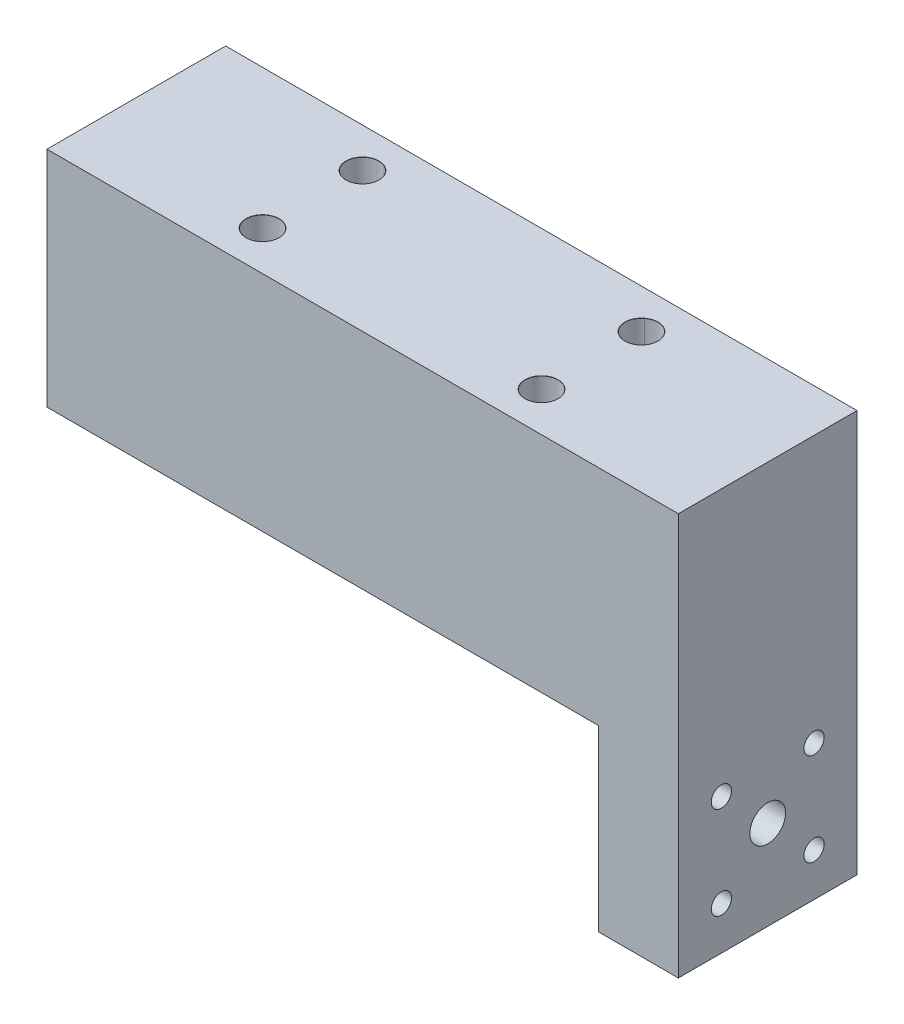
ISO-10303-21;
HEADER;
FILE_DESCRIPTION(('STEP AP214'),'2;1');
FILE_NAME('part.step','',(''),(''),'','','');
FILE_SCHEMA(('AUTOMOTIVE_DESIGN { 1 0 10303 214 1 1 1 1 }'));
ENDSEC;
DATA;
#1=APPLICATION_CONTEXT('core data for automotive mechanical design processes');
#2=APPLICATION_PROTOCOL_DEFINITION('international standard','automotive_design',2000,#1);
#3=PRODUCT_CONTEXT('',#1,'mechanical');
#4=PRODUCT('Part','Part','',(#3));
#5=PRODUCT_RELATED_PRODUCT_CATEGORY('part','',(#4));
#6=PRODUCT_DEFINITION_FORMATION('','',#4);
#7=PRODUCT_DEFINITION_CONTEXT('part definition',#1,'design');
#8=PRODUCT_DEFINITION('design','',#6,#7);
#9=PRODUCT_DEFINITION_SHAPE('','',#8);
#10=(LENGTH_UNIT() NAMED_UNIT(*) SI_UNIT(.MILLI.,.METRE.));
#11=(NAMED_UNIT(*) PLANE_ANGLE_UNIT() SI_UNIT($,.RADIAN.));
#12=(NAMED_UNIT(*) SI_UNIT($,.STERADIAN.) SOLID_ANGLE_UNIT());
#13=UNCERTAINTY_MEASURE_WITH_UNIT(LENGTH_MEASURE(1.E-05),#10,'distance_accuracy_value','');
#14=(GEOMETRIC_REPRESENTATION_CONTEXT(3) GLOBAL_UNCERTAINTY_ASSIGNED_CONTEXT((#13)) GLOBAL_UNIT_ASSIGNED_CONTEXT((#10,
#11,#12)) REPRESENTATION_CONTEXT('',''));
#15=CARTESIAN_POINT('',(0.,0.,0.));
#16=DIRECTION('',(0.,0.,1.));
#17=DIRECTION('',(1.,0.,0.));
#18=AXIS2_PLACEMENT_3D('',#15,#16,#17);
#19=CARTESIAN_POINT('',(15.7940014178421,-24.5903236205962,15.));
#20=DIRECTION('',(1.,0.,0.));
#21=DIRECTION('',(0.,1.,0.));
#22=AXIS2_PLACEMENT_3D('',#19,#20,#21);
#23=CYLINDRICAL_SURFACE('',#22,3.);
#24=CARTESIAN_POINT('',(45.7940014178421,-24.5903236205962,15.));
#25=DIRECTION('',(1.,0.,0.));
#26=DIRECTION('',(0.,1.,0.));
#27=AXIS2_PLACEMENT_3D('',#24,#25,#26);
#28=CIRCLE('',#27,3.);
#29=CARTESIAN_POINT('',(45.7940014178421,-21.5903236205962,15.));
#30=VERTEX_POINT('',#29);
#31=EDGE_CURVE('E270',#30,#30,#28,.T.);
#32=ORIENTED_EDGE('',*,*,#31,.T.);
#33=EDGE_LOOP('',(#32));
#34=FACE_BOUND('',#33,.T.);
#35=CARTESIAN_POINT('',(34.3940014178421,-24.5903236205962,15.));
#36=DIRECTION('',(-1.,0.,0.));
#37=DIRECTION('',(0.,0.,1.));
#38=AXIS2_PLACEMENT_3D('',#35,#36,#37);
#39=CIRCLE('',#38,3.);
#40=CARTESIAN_POINT('',(34.3940014178421,-24.5903236205962,18.));
#41=VERTEX_POINT('',#40);
#42=EDGE_CURVE('E166',#41,#41,#39,.F.);
#43=ORIENTED_EDGE('',*,*,#42,.F.);
#44=EDGE_LOOP('',(#43));
#45=FACE_BOUND('',#44,.T.);
#46=ADVANCED_FACE('F45',(#34,#45),#23,.F.);
#47=CARTESIAN_POINT('',(-60.2059985821579,27.9096763794038,30.));
#48=DIRECTION('',(1.,0.,0.));
#49=DIRECTION('',(0.,1.,0.));
#50=AXIS2_PLACEMENT_3D('',#47,#48,#49);
#51=PLANE('',#50);
#52=DIRECTION('',(0.,0.,-1.));
#53=VECTOR('',#52,1.);
#54=CARTESIAN_POINT('',(-60.2059985821578,-9.59032362059618,30.));
#55=LINE('',#54,#53);
#56=CARTESIAN_POINT('',(-60.2059985821578,-9.59032362059618,30.));
#57=VERTEX_POINT('',#56);
#58=CARTESIAN_POINT('',(-60.2059985821578,-9.59032362059618,0.));
#59=VERTEX_POINT('',#58);
#60=EDGE_CURVE('E265',#57,#59,#55,.T.);
#61=ORIENTED_EDGE('',*,*,#60,.F.);
#62=DIRECTION('',(0.,-1.,0.));
#63=VECTOR('',#62,1.);
#64=CARTESIAN_POINT('',(-60.2059985821579,27.9096763794038,30.));
#65=LINE('',#64,#63);
#66=CARTESIAN_POINT('',(-60.2059985821579,27.9096763794038,30.));
#67=VERTEX_POINT('',#66);
#68=EDGE_CURVE('E136',#67,#57,#65,.T.);
#69=ORIENTED_EDGE('',*,*,#68,.F.);
#70=DIRECTION('',(0.,0.,-1.));
#71=VECTOR('',#70,1.);
#72=CARTESIAN_POINT('',(-60.2059985821579,27.9096763794038,30.));
#73=LINE('',#72,#71);
#74=CARTESIAN_POINT('',(-60.2059985821579,27.9096763794038,0.));
#75=VERTEX_POINT('',#74);
#76=EDGE_CURVE('E131',#67,#75,#73,.T.);
#77=ORIENTED_EDGE('',*,*,#76,.T.);
#78=DIRECTION('',(0.,-1.,0.));
#79=VECTOR('',#78,1.);
#80=CARTESIAN_POINT('',(-60.2059985821579,27.9096763794038,0.));
#81=LINE('',#80,#79);
#82=EDGE_CURVE('E144',#75,#59,#81,.T.);
#83=ORIENTED_EDGE('',*,*,#82,.T.);
#84=EDGE_LOOP('',(#61,#69,#77,#83));
#85=FACE_BOUND('',#84,.T.);
#86=ADVANCED_FACE('F42',(#85),#51,.F.);
#87=CARTESIAN_POINT('',(-60.2059985821578,-39.5903236205962,30.));
#88=DIRECTION('',(0.,1.,0.));
#89=DIRECTION('',(0.,0.,1.));
#90=AXIS2_PLACEMENT_3D('',#87,#88,#89);
#91=PLANE('',#90);
#92=DIRECTION('',(1.,0.,0.));
#93=VECTOR('',#92,1.);
#94=CARTESIAN_POINT('',(-60.2059985821578,-39.5903236205962,30.));
#95=LINE('',#94,#93);
#96=CARTESIAN_POINT('',(32.3940014178421,-39.5903236205962,30.));
#97=VERTEX_POINT('',#96);
#98=CARTESIAN_POINT('',(45.7940014178422,-39.5903236205962,30.));
#99=VERTEX_POINT('',#98);
#100=EDGE_CURVE('E247',#97,#99,#95,.T.);
#101=ORIENTED_EDGE('',*,*,#100,.F.);
#102=DIRECTION('',(0.,0.,-1.));
#103=VECTOR('',#102,1.);
#104=CARTESIAN_POINT('',(32.3940014178421,-39.5903236205962,30.));
#105=LINE('',#104,#103);
#106=CARTESIAN_POINT('',(32.3940014178421,-39.5903236205962,0.));
#107=VERTEX_POINT('',#106);
#108=EDGE_CURVE('E152',#97,#107,#105,.T.);
#109=ORIENTED_EDGE('',*,*,#108,.T.);
#110=DIRECTION('',(1.,0.,0.));
#111=VECTOR('',#110,1.);
#112=CARTESIAN_POINT('',(-60.2059985821578,-39.5903236205962,0.));
#113=LINE('',#112,#111);
#114=CARTESIAN_POINT('',(45.7940014178422,-39.5903236205962,0.));
#115=VERTEX_POINT('',#114);
#116=EDGE_CURVE('E155',#107,#115,#113,.T.);
#117=ORIENTED_EDGE('',*,*,#116,.T.);
#118=DIRECTION('',(0.,0.,-1.));
#119=VECTOR('',#118,1.);
#120=CARTESIAN_POINT('',(45.7940014178422,-39.5903236205962,30.));
#121=LINE('',#120,#119);
#122=EDGE_CURVE('E165',#99,#115,#121,.T.);
#123=ORIENTED_EDGE('',*,*,#122,.F.);
#124=EDGE_LOOP('',(#101,#109,#117,#123));
#125=FACE_BOUND('',#124,.T.);
#126=ADVANCED_FACE('F212',(#125),#91,.F.);
#127=CARTESIAN_POINT('',(45.7940014178421,27.9096763794038,30.));
#128=DIRECTION('',(-1.,0.,0.));
#129=DIRECTION('',(0.,-1.,0.));
#130=AXIS2_PLACEMENT_3D('',#127,#128,#129);
#131=PLANE('',#130);
#132=CARTESIAN_POINT('',(45.7940014178422,-16.8121490275442,7.22182540694798));
#133=DIRECTION('',(-1.,0.,0.));
#134=DIRECTION('',(0.,0.,1.));
#135=AXIS2_PLACEMENT_3D('',#132,#133,#134);
#136=CIRCLE('',#135,1.7);
#137=CARTESIAN_POINT('',(45.7940014178422,-16.8121490275442,8.92182540694797));
#138=VERTEX_POINT('',#137);
#139=EDGE_CURVE('E300',#138,#138,#136,.T.);
#140=ORIENTED_EDGE('',*,*,#139,.T.);
#141=EDGE_LOOP('',(#140));
#142=FACE_BOUND('',#141,.T.);
#143=CARTESIAN_POINT('',(45.7940014178422,-16.8121490275442,22.7781745930521));
#144=DIRECTION('',(-1.,0.,0.));
#145=DIRECTION('',(0.,0.,1.));
#146=AXIS2_PLACEMENT_3D('',#143,#144,#145);
#147=CIRCLE('',#146,1.7);
#148=CARTESIAN_POINT('',(45.7940014178422,-16.8121490275442,24.4781745930521));
#149=VERTEX_POINT('',#148);
#150=EDGE_CURVE('E290',#149,#149,#147,.T.);
#151=ORIENTED_EDGE('',*,*,#150,.T.);
#152=EDGE_LOOP('',(#151));
#153=FACE_BOUND('',#152,.T.);
#154=CARTESIAN_POINT('',(45.7940014178422,-32.3684982136482,22.778174593052));
#155=DIRECTION('',(-1.,0.,0.));
#156=DIRECTION('',(0.,0.,1.));
#157=AXIS2_PLACEMENT_3D('',#154,#155,#156);
#158=CIRCLE('',#157,1.7);
#159=CARTESIAN_POINT('',(45.7940014178422,-32.3684982136482,24.478174593052));
#160=VERTEX_POINT('',#159);
#161=EDGE_CURVE('E278',#160,#160,#158,.T.);
#162=ORIENTED_EDGE('',*,*,#161,.T.);
#163=EDGE_LOOP('',(#162));
#164=FACE_BOUND('',#163,.T.);
#165=CARTESIAN_POINT('',(45.7940014178422,-32.3684982136484,7.22182540694819));
#166=DIRECTION('',(-1.,0.,0.));
#167=DIRECTION('',(0.,0.,1.));
#168=AXIS2_PLACEMENT_3D('',#165,#166,#167);
#169=CIRCLE('',#168,1.7);
#170=CARTESIAN_POINT('',(45.7940014178422,-32.3684982136484,8.92182540694819));
#171=VERTEX_POINT('',#170);
#172=EDGE_CURVE('E269',#171,#171,#169,.T.);
#173=ORIENTED_EDGE('',*,*,#172,.T.);
#174=EDGE_LOOP('',(#173));
#175=FACE_BOUND('',#174,.T.);
#176=ORIENTED_EDGE('',*,*,#31,.F.);
#177=EDGE_LOOP('',(#176));
#178=FACE_BOUND('',#177,.T.);
#179=DIRECTION('',(0.,1.,0.));
#180=VECTOR('',#179,1.);
#181=CARTESIAN_POINT('',(45.7940014178421,27.9096763794038,0.));
#182=LINE('',#181,#180);
#183=CARTESIAN_POINT('',(45.7940014178421,27.9096763794038,0.));
#184=VERTEX_POINT('',#183);
#185=EDGE_CURVE('E137',#115,#184,#182,.T.);
#186=ORIENTED_EDGE('',*,*,#185,.T.);
#187=DIRECTION('',(0.,0.,-1.));
#188=VECTOR('',#187,1.);
#189=CARTESIAN_POINT('',(45.7940014178421,27.9096763794038,30.));
#190=LINE('',#189,#188);
#191=CARTESIAN_POINT('',(45.7940014178421,27.9096763794038,30.));
#192=VERTEX_POINT('',#191);
#193=EDGE_CURVE('E133',#192,#184,#190,.T.);
#194=ORIENTED_EDGE('',*,*,#193,.F.);
#195=DIRECTION('',(0.,1.,0.));
#196=VECTOR('',#195,1.);
#197=CARTESIAN_POINT('',(45.7940014178421,27.9096763794038,30.));
#198=LINE('',#197,#196);
#199=EDGE_CURVE('E260',#99,#192,#198,.T.);
#200=ORIENTED_EDGE('',*,*,#199,.F.);
#201=ORIENTED_EDGE('',*,*,#122,.T.);
#202=EDGE_LOOP('',(#186,#194,#200,#201));
#203=FACE_BOUND('',#202,.T.);
#204=ADVANCED_FACE('F209',(#142,#153,#164,#175,#178,#203),#131,.F.);
#205=CARTESIAN_POINT('',(-60.2059985821579,27.9096763794038,30.));
#206=DIRECTION('',(0.,-1.,0.));
#207=DIRECTION('',(0.,0.,-1.));
#208=AXIS2_PLACEMENT_3D('',#205,#206,#207);
#209=PLANE('',#208);
#210=CARTESIAN_POINT('',(-30.6242090565358,27.9096763794038,6.6141635759869));
#211=DIRECTION('',(0.,1.,0.));
#212=DIRECTION('',(0.,0.,1.));
#213=AXIS2_PLACEMENT_3D('',#210,#211,#212);
#214=CIRCLE('',#213,2.775);
#215=CARTESIAN_POINT('',(-31.7195661816328,27.9096763794038,9.16383370533685));
#216=VERTEX_POINT('',#215);
#217=CARTESIAN_POINT('',(-29.5288811747591,27.9096763794038,4.06448088368921));
#218=VERTEX_POINT('',#217);
#219=EDGE_CURVE('E610',#216,#218,#214,.T.);
#220=ORIENTED_EDGE('',*,*,#219,.F.);
#221=CARTESIAN_POINT('',(-30.6242382992522,27.9096763794038,6.61415101329855));
#222=DIRECTION('',(0.,1.,0.));
#223=DIRECTION('',(0.,0.,1.));
#224=AXIS2_PLACEMENT_3D('',#221,#222,#223);
#225=CIRCLE('',#224,2.775);
#226=EDGE_CURVE('E60',#218,#216,#225,.T.);
#227=ORIENTED_EDGE('',*,*,#226,.F.);
#228=EDGE_LOOP('',(#220,#227));
#229=FACE_BOUND('',#228,.T.);
#230=CARTESIAN_POINT('',(16.2122227726959,27.9096763794038,6.6141620925815));
#231=DIRECTION('',(0.,1.,0.));
#232=DIRECTION('',(0.,0.,1.));
#233=AXIS2_PLACEMENT_3D('',#230,#231,#232);
#234=CIRCLE('',#233,2.775);
#235=CARTESIAN_POINT('',(14.5385075322435,27.9096763794038,4.40072533182294));
#236=VERTEX_POINT('',#235);
#237=CARTESIAN_POINT('',(17.8859515264885,27.9096763794038,8.82758863501017));
#238=VERTEX_POINT('',#237);
#239=EDGE_CURVE('E196',#236,#238,#234,.T.);
#240=ORIENTED_EDGE('',*,*,#239,.F.);
#241=CARTESIAN_POINT('',(14.5385075322435,27.9096763794038,4.40072533182294));
#242=CARTESIAN_POINT('',(14.7562897477303,27.9096763794038,4.23604475663374));
#243=CARTESIAN_POINT('',(15.0024868107985,27.9096763794038,4.11672695901462));
#244=CARTESIAN_POINT('',(15.1246709466571,27.9096763794038,4.0575112160932));
#245=CARTESIAN_POINT('',(15.2531030303617,27.9096763794038,4.01017637552189));
#246=CARTESIAN_POINT('',(15.380502982951,27.9096763794038,3.9632219364856));
#247=CARTESIAN_POINT('',(15.5129562633657,27.9096763794038,3.92870359695053));
#248=CARTESIAN_POINT('',(15.6443450967281,27.9096763794038,3.8944626604715));
#249=CARTESIAN_POINT('',(15.7795439714078,27.9096763794038,3.8730932537429));
#250=CARTESIAN_POINT('',(15.9136563343446,27.9096763794038,3.85189558003651));
#251=CARTESIAN_POINT('',(16.0502987591571,27.9096763794038,3.84388090598367));
#252=CARTESIAN_POINT('',(16.185843071284,27.9096763794038,3.83593064102823));
#253=CARTESIAN_POINT('',(16.3226130998716,27.9096763794038,3.84134788564343));
#254=CARTESIAN_POINT('',(16.4582839902984,27.9096763794038,3.84672159513369));
#255=CARTESIAN_POINT('',(16.5938644474031,27.9096763794038,3.86551858718748));
#256=CARTESIAN_POINT('',(16.7283553262193,27.9096763794038,3.88416451916324));
#257=CARTESIAN_POINT('',(16.8614404928488,27.9096763794038,3.91616023264291));
#258=CARTESIAN_POINT('',(16.9934561343349,27.9096763794038,3.94789881588849));
#259=CARTESIAN_POINT('',(17.1227643226115,27.9096763794038,3.99278511338637));
#260=CARTESIAN_POINT('',(17.2510333390368,27.9096763794038,4.03731068680721));
#261=CARTESIAN_POINT('',(17.3753192355827,27.9096763794038,4.09465528706305));
#262=CARTESIAN_POINT('',(17.4986063214085,27.9096763794038,4.15153904338517));
#263=CARTESIAN_POINT('',(17.616672980444,27.9096763794038,4.2207896844025));
#264=CARTESIAN_POINT('',(17.7337908090184,27.9096763794038,4.28948379982497));
#265=CARTESIAN_POINT('',(17.8445011796684,27.9096763794038,4.3699735574887));
#266=CARTESIAN_POINT('',(17.9543218379078,27.9096763794038,4.4498164675636));
#267=CARTESIAN_POINT('',(18.0566097146325,27.9096763794038,4.54077017849202));
#268=CARTESIAN_POINT('',(18.1580755654546,27.9096763794038,4.63099294936458));
#269=CARTESIAN_POINT('',(18.2509558562614,27.9096763794038,4.7315346761973));
#270=CARTESIAN_POINT('',(18.3430897242488,27.9096763794038,4.83126840987485));
#271=CARTESIAN_POINT('',(18.4256679377021,27.9096763794038,4.94042987707437));
#272=CARTESIAN_POINT('',(18.5075825199002,27.9096763794038,5.04871407945471));
#273=CARTESIAN_POINT('',(18.5790633795684,27.9096763794038,5.16544399833217));
#274=CARTESIAN_POINT('',(18.649969790711,27.9096763794038,5.2812358293059));
#275=CARTESIAN_POINT('',(18.7096648941637,27.9096763794038,5.40441002256201));
#276=CARTESIAN_POINT('',(18.7688802640961,27.9096763794038,5.52659433916277));
#277=CARTESIAN_POINT('',(18.8162147126236,27.9096763794038,5.65502656738088));
#278=CARTESIAN_POINT('',(18.8631687627568,27.9096763794038,5.78242666329515));
#279=CARTESIAN_POINT('',(18.8976866979654,27.9096763794038,5.91488004908792));
#280=CARTESIAN_POINT('',(18.931927233365,27.9096763794038,6.04626898697278));
#281=CARTESIAN_POINT('',(18.9532962273858,27.9096763794038,6.18146792688514));
#282=CARTESIAN_POINT('',(18.9744934917013,27.9096763794038,6.31558035453136));
#283=CARTESIAN_POINT('',(18.9825077486375,27.9096763794038,6.45222280380697));
#284=CARTESIAN_POINT('',(18.9904575998289,27.9096763794038,6.58776714020686));
#285=CARTESIAN_POINT('',(18.9850399377097,27.9096763794038,6.72453715225247));
#286=CARTESIAN_POINT('',(18.9796658140707,27.9096763794038,6.86020802626963));
#287=CARTESIAN_POINT('',(18.9608684081426,27.9096763794038,6.99578842599912));
#288=CARTESIAN_POINT('',(18.9422220656198,27.9096763794038,7.13027924789243));
#289=CARTESIAN_POINT('',(18.9102259458835,27.9096763794038,7.26336431685465));
#290=CARTESIAN_POINT('',(18.8784869596473,27.9096763794038,7.39537986145301));
#291=CARTESIAN_POINT('',(18.833600267422,27.9096763794038,7.52468791271065));
#292=CARTESIAN_POINT('',(18.7890743024457,27.9096763794038,7.6529567932184));
#293=CARTESIAN_POINT('',(18.7317293227954,27.9096763794038,7.77724251471126));
#294=CARTESIAN_POINT('',(18.6748451901299,27.9096763794038,7.90052942688636));
#295=CARTESIAN_POINT('',(18.6055941886989,27.9096763794038,8.01859587453304));
#296=CARTESIAN_POINT('',(18.5368997157628,27.9096763794038,8.13571349341135));
#297=CARTESIAN_POINT('',(18.456409620144,27.9096763794038,8.24642361835688));
#298=CARTESIAN_POINT('',(18.3765663748266,27.9096763794038,8.35624403287101));
#299=CARTESIAN_POINT('',(18.2856123516579,27.9096763794038,8.45853163194546));
#300=CARTESIAN_POINT('',(18.1953892710578,27.9096763794038,8.55999720734469));
#301=CARTESIAN_POINT('',(18.0948472606916,27.9096763794038,8.65287719124484));
#302=CARTESIAN_POINT('',(17.9949103507752,27.9096763794038,8.74519818771437));
#303=CARTESIAN_POINT('',(17.8859515264885,27.9096763794038,8.82758863501017));
#304=B_SPLINE_CURVE_WITH_KNOTS('',2,(#241,#242,#243,#244,#245,#246,#247,#248,#249,#250,#251,
#252,#253,#254,#255,#256,#257,#258,#259,#260,#261,#262,#263,#264,#265,#266,#267,#268,#269,#270,
#271,#272,#273,#274,#275,#276,#277,#278,#279,#280,#281,#282,#283,#284,#285,#286,#287,#288,#289,
#290,#291,#292,#293,#294,#295,#296,#297,#298,#299,#300,#301,#302,#303),.UNSPECIFIED.,.F.,.F.,(3,
2,2,2,2,2,2,2,2,2,2,2,2,2,2,2,2,2,2,2,2,2,2,2,2,2,2,2,2,2,2,3),(0.,0.0625,0.09375,0.125,0.15625,
0.1875,0.21875,0.25,0.28125,0.3125,0.34375,0.375,0.40625,0.4375,0.46875,0.5,0.53125,0.5625,
0.59375,0.625,0.65625,0.6875,0.71875,0.75,0.78125,0.8125,0.84375,0.875,0.90625,0.9375,0.96875,
1.),.UNSPECIFIED.);
#305=EDGE_CURVE('E66',#236,#238,#304,.T.);
#306=ORIENTED_EDGE('',*,*,#305,.T.);
#307=EDGE_LOOP('',(#240,#306));
#308=FACE_BOUND('',#307,.T.);
#309=CARTESIAN_POINT('',(16.212229799726,27.9096763794038,23.3858441283466));
#310=DIRECTION('',(0.,1.,0.));
#311=DIRECTION('',(0.,0.,1.));
#312=AXIS2_PLACEMENT_3D('',#309,#310,#311);
#313=CIRCLE('',#312,2.775);
#314=CARTESIAN_POINT('',(16.212229799726,27.9096763794038,26.1608441283466));
#315=VERTEX_POINT('',#314);
#316=EDGE_CURVE('E187',#315,#315,#313,.T.);
#317=ORIENTED_EDGE('',*,*,#316,.F.);
#318=EDGE_LOOP('',(#317));
#319=FACE_BOUND('',#318,.T.);
#320=CARTESIAN_POINT('',(-30.6242230610333,27.9096763794038,23.3858497429351));
#321=DIRECTION('',(0.,1.,0.));
#322=DIRECTION('',(0.,0.,1.));
#323=AXIS2_PLACEMENT_3D('',#320,#321,#322);
#324=CIRCLE('',#323,2.775);
#325=CARTESIAN_POINT('',(-30.6242230610333,27.9096763794038,26.1608497429351));
#326=VERTEX_POINT('',#325);
#327=EDGE_CURVE('E181',#326,#326,#324,.T.);
#328=ORIENTED_EDGE('',*,*,#327,.F.);
#329=EDGE_LOOP('',(#328));
#330=FACE_BOUND('',#329,.T.);
#331=DIRECTION('',(-1.,0.,0.));
#332=VECTOR('',#331,1.);
#333=CARTESIAN_POINT('',(-60.2059985821579,27.9096763794038,0.));
#334=LINE('',#333,#332);
#335=EDGE_CURVE('E130',#184,#75,#334,.T.);
#336=ORIENTED_EDGE('',*,*,#335,.T.);
#337=ORIENTED_EDGE('',*,*,#76,.F.);
#338=DIRECTION('',(-1.,0.,0.));
#339=VECTOR('',#338,1.);
#340=CARTESIAN_POINT('',(-60.2059985821579,27.9096763794038,30.));
#341=LINE('',#340,#339);
#342=EDGE_CURVE('E146',#192,#67,#341,.T.);
#343=ORIENTED_EDGE('',*,*,#342,.F.);
#344=ORIENTED_EDGE('',*,*,#193,.T.);
#345=EDGE_LOOP('',(#336,#337,#343,#344));
#346=FACE_BOUND('',#345,.T.);
#347=ADVANCED_FACE('F128',(#229,#308,#319,#330,#346),#209,.F.);
#348=CARTESIAN_POINT('',(0.,0.,30.));
#349=DIRECTION('',(0.,0.,1.));
#350=DIRECTION('',(1.,0.,0.));
#351=AXIS2_PLACEMENT_3D('',#348,#349,#350);
#352=PLANE('',#351);
#353=DIRECTION('',(0.,1.,0.));
#354=VECTOR('',#353,1.);
#355=CARTESIAN_POINT('',(32.3940014178421,-39.5903236205962,30.));
#356=LINE('',#355,#354);
#357=CARTESIAN_POINT('',(32.3940014178421,-9.59032362059618,30.));
#358=VERTEX_POINT('',#357);
#359=EDGE_CURVE('E250',#97,#358,#356,.T.);
#360=ORIENTED_EDGE('',*,*,#359,.F.);
#361=ORIENTED_EDGE('',*,*,#100,.T.);
#362=ORIENTED_EDGE('',*,*,#199,.T.);
#363=ORIENTED_EDGE('',*,*,#342,.T.);
#364=ORIENTED_EDGE('',*,*,#68,.T.);
#365=DIRECTION('',(-1.,0.,0.));
#366=VECTOR('',#365,1.);
#367=CARTESIAN_POINT('',(-60.2059985821578,-9.59032362059618,30.));
#368=LINE('',#367,#366);
#369=EDGE_CURVE('E249',#358,#57,#368,.T.);
#370=ORIENTED_EDGE('',*,*,#369,.F.);
#371=EDGE_LOOP('',(#360,#361,#362,#363,#364,#370));
#372=FACE_BOUND('',#371,.T.);
#373=ADVANCED_FACE('F206',(#372),#352,.T.);
#374=CARTESIAN_POINT('',(0.,0.,0.));
#375=DIRECTION('',(0.,0.,1.));
#376=DIRECTION('',(1.,0.,0.));
#377=AXIS2_PLACEMENT_3D('',#374,#375,#376);
#378=PLANE('',#377);
#379=DIRECTION('',(0.,1.,0.));
#380=VECTOR('',#379,1.);
#381=CARTESIAN_POINT('',(32.3940014178421,-39.5903236205962,0.));
#382=LINE('',#381,#380);
#383=CARTESIAN_POINT('',(32.3940014178421,-9.59032362059618,0.));
#384=VERTEX_POINT('',#383);
#385=EDGE_CURVE('E264',#107,#384,#382,.T.);
#386=ORIENTED_EDGE('',*,*,#385,.T.);
#387=DIRECTION('',(-1.,0.,0.));
#388=VECTOR('',#387,1.);
#389=CARTESIAN_POINT('',(-60.2059985821578,-9.59032362059618,0.));
#390=LINE('',#389,#388);
#391=EDGE_CURVE('E151',#384,#59,#390,.T.);
#392=ORIENTED_EDGE('',*,*,#391,.T.);
#393=ORIENTED_EDGE('',*,*,#82,.F.);
#394=ORIENTED_EDGE('',*,*,#335,.F.);
#395=ORIENTED_EDGE('',*,*,#185,.F.);
#396=ORIENTED_EDGE('',*,*,#116,.F.);
#397=EDGE_LOOP('',(#386,#392,#393,#394,#395,#396));
#398=FACE_BOUND('',#397,.T.);
#399=ADVANCED_FACE('F149',(#398),#378,.F.);
#400=CARTESIAN_POINT('',(32.3940014178421,-39.5903236205962,30.));
#401=DIRECTION('',(-1.,0.,0.));
#402=DIRECTION('',(0.,0.,1.));
#403=AXIS2_PLACEMENT_3D('',#400,#401,#402);
#404=PLANE('',#403);
#405=CARTESIAN_POINT('',(32.3940014178421,-24.5903236205962,15.));
#406=DIRECTION('',(-1.,0.,0.));
#407=DIRECTION('',(0.,0.,1.));
#408=AXIS2_PLACEMENT_3D('',#405,#406,#407);
#409=CIRCLE('',#408,9.);
#410=CARTESIAN_POINT('',(32.3940014178421,-24.5903236205962,24.));
#411=VERTEX_POINT('',#410);
#412=EDGE_CURVE('E176',#411,#411,#409,.T.);
#413=ORIENTED_EDGE('',*,*,#412,.F.);
#414=EDGE_LOOP('',(#413));
#415=FACE_BOUND('',#414,.T.);
#416=CARTESIAN_POINT('',(32.3940014178421,-16.8121490275442,7.22182540694798));
#417=DIRECTION('',(-1.,0.,0.));
#418=DIRECTION('',(0.,0.,1.));
#419=AXIS2_PLACEMENT_3D('',#416,#417,#418);
#420=CIRCLE('',#419,1.725);
#421=CARTESIAN_POINT('',(32.3940014178421,-16.8121490275442,8.94682540694798));
#422=VERTEX_POINT('',#421);
#423=EDGE_CURVE('E171',#422,#422,#420,.T.);
#424=ORIENTED_EDGE('',*,*,#423,.F.);
#425=EDGE_LOOP('',(#424));
#426=FACE_BOUND('',#425,.T.);
#427=CARTESIAN_POINT('',(32.3940014178421,-16.8121490275442,22.7781745930521));
#428=DIRECTION('',(-1.,0.,0.));
#429=DIRECTION('',(0.,0.,1.));
#430=AXIS2_PLACEMENT_3D('',#427,#428,#429);
#431=CIRCLE('',#430,1.725);
#432=CARTESIAN_POINT('',(32.3940014178421,-16.8121490275442,24.5031745930521));
#433=VERTEX_POINT('',#432);
#434=EDGE_CURVE('E295',#433,#433,#431,.T.);
#435=ORIENTED_EDGE('',*,*,#434,.F.);
#436=EDGE_LOOP('',(#435));
#437=FACE_BOUND('',#436,.T.);
#438=CARTESIAN_POINT('',(32.3940014178421,-32.3684982136482,22.778174593052));
#439=DIRECTION('',(-1.,0.,0.));
#440=DIRECTION('',(0.,0.,1.));
#441=AXIS2_PLACEMENT_3D('',#438,#439,#440);
#442=CIRCLE('',#441,1.725);
#443=CARTESIAN_POINT('',(32.3940014178421,-32.3684982136482,24.503174593052));
#444=VERTEX_POINT('',#443);
#445=EDGE_CURVE('E284',#444,#444,#442,.T.);
#446=ORIENTED_EDGE('',*,*,#445,.F.);
#447=EDGE_LOOP('',(#446));
#448=FACE_BOUND('',#447,.T.);
#449=CARTESIAN_POINT('',(32.3940014178421,-32.3684982136484,7.22182540694819));
#450=DIRECTION('',(-1.,0.,0.));
#451=DIRECTION('',(0.,0.,1.));
#452=AXIS2_PLACEMENT_3D('',#449,#450,#451);
#453=CIRCLE('',#452,1.725);
#454=CARTESIAN_POINT('',(32.3940014178421,-32.3684982136484,8.94682540694819));
#455=VERTEX_POINT('',#454);
#456=EDGE_CURVE('E276',#455,#455,#453,.T.);
#457=ORIENTED_EDGE('',*,*,#456,.F.);
#458=EDGE_LOOP('',(#457));
#459=FACE_BOUND('',#458,.T.);
#460=ORIENTED_EDGE('',*,*,#385,.F.);
#461=ORIENTED_EDGE('',*,*,#108,.F.);
#462=ORIENTED_EDGE('',*,*,#359,.T.);
#463=DIRECTION('',(0.,0.,-1.));
#464=VECTOR('',#463,1.);
#465=CARTESIAN_POINT('',(32.3940014178421,-9.59032362059618,30.));
#466=LINE('',#465,#464);
#467=EDGE_CURVE('E159',#358,#384,#466,.T.);
#468=ORIENTED_EDGE('',*,*,#467,.T.);
#469=EDGE_LOOP('',(#460,#461,#462,#468));
#470=FACE_BOUND('',#469,.T.);
#471=ADVANCED_FACE('F238',(#415,#426,#437,#448,#459,#470),#404,.T.);
#472=CARTESIAN_POINT('',(-60.2059985821578,-9.59032362059618,30.));
#473=DIRECTION('',(0.,-1.,0.));
#474=DIRECTION('',(0.,0.,-1.));
#475=AXIS2_PLACEMENT_3D('',#472,#473,#474);
#476=PLANE('',#475);
#477=CARTESIAN_POINT('',(-30.6242382992522,-9.59032362059617,6.61415101329855));
#478=DIRECTION('',(0.,-1.,0.));
#479=DIRECTION('',(0.,0.,-1.));
#480=AXIS2_PLACEMENT_3D('',#477,#478,#479);
#481=CIRCLE('',#480,2.75);
#482=CARTESIAN_POINT('',(-31.7096982308405,-9.59032362059618,9.14086364771432));
#483=VERTEX_POINT('',#482);
#484=CARTESIAN_POINT('',(-29.5387491249475,-9.59032362059618,4.08745094157114));
#485=VERTEX_POINT('',#484);
#486=EDGE_CURVE('E605',#483,#485,#481,.T.);
#487=ORIENTED_EDGE('',*,*,#486,.F.);
#488=CARTESIAN_POINT('',(-30.6242090565358,-9.59032362059618,6.6141635759869));
#489=DIRECTION('',(0.,-1.,0.));
#490=DIRECTION('',(0.,0.,-1.));
#491=AXIS2_PLACEMENT_3D('',#488,#489,#490);
#492=CIRCLE('',#491,2.75);
#493=EDGE_CURVE('E372',#485,#483,#492,.T.);
#494=ORIENTED_EDGE('',*,*,#493,.F.);
#495=EDGE_LOOP('',(#487,#494));
#496=FACE_BOUND('',#495,.T.);
#497=CARTESIAN_POINT('',(16.2122362860981,-9.59032362059618,6.61415187420469));
#498=DIRECTION('',(0.,1.,0.));
#499=DIRECTION('',(0.,0.,1.));
#500=AXIS2_PLACEMENT_3D('',#497,#498,#499);
#501=CIRCLE('',#500,2.75);
#502=CARTESIAN_POINT('',(14.5535861088231,-9.59032362059618,4.42066615749134));
#503=VERTEX_POINT('',#502);
#504=CARTESIAN_POINT('',(17.8708729499709,-9.59032362059618,8.80764780929485));
#505=VERTEX_POINT('',#504);
#506=EDGE_CURVE('E82',#503,#505,#501,.F.);
#507=ORIENTED_EDGE('',*,*,#506,.F.);
#508=CARTESIAN_POINT('',(16.2122227726959,-9.59032362059618,6.6141620925815));
#509=DIRECTION('',(0.,-1.,0.));
#510=DIRECTION('',(0.,0.,-1.));
#511=AXIS2_PLACEMENT_3D('',#508,#509,#510);
#512=CIRCLE('',#511,2.75);
#513=EDGE_CURVE('E182',#505,#503,#512,.T.);
#514=ORIENTED_EDGE('',*,*,#513,.F.);
#515=EDGE_LOOP('',(#507,#514));
#516=FACE_BOUND('',#515,.T.);
#517=CARTESIAN_POINT('',(16.212229799726,-9.59032362059618,23.3858441283466));
#518=DIRECTION('',(0.,-1.,0.));
#519=DIRECTION('',(0.,0.,-1.));
#520=AXIS2_PLACEMENT_3D('',#517,#518,#519);
#521=CIRCLE('',#520,2.75);
#522=CARTESIAN_POINT('',(16.212229799726,-9.59032362059618,20.6358441283466));
#523=VERTEX_POINT('',#522);
#524=EDGE_CURVE('E178',#523,#523,#521,.T.);
#525=ORIENTED_EDGE('',*,*,#524,.F.);
#526=EDGE_LOOP('',(#525));
#527=FACE_BOUND('',#526,.T.);
#528=CARTESIAN_POINT('',(-30.6242230610333,-9.59032362059618,23.3858497429351));
#529=DIRECTION('',(0.,-1.,0.));
#530=DIRECTION('',(0.,0.,-1.));
#531=AXIS2_PLACEMENT_3D('',#528,#529,#530);
#532=CIRCLE('',#531,2.75);
#533=CARTESIAN_POINT('',(-30.6242230610333,-9.59032362059618,20.6358497429351));
#534=VERTEX_POINT('',#533);
#535=EDGE_CURVE('E173',#534,#534,#532,.T.);
#536=ORIENTED_EDGE('',*,*,#535,.F.);
#537=EDGE_LOOP('',(#536));
#538=FACE_BOUND('',#537,.T.);
#539=ORIENTED_EDGE('',*,*,#391,.F.);
#540=ORIENTED_EDGE('',*,*,#467,.F.);
#541=ORIENTED_EDGE('',*,*,#369,.T.);
#542=ORIENTED_EDGE('',*,*,#60,.T.);
#543=EDGE_LOOP('',(#539,#540,#541,#542));
#544=FACE_BOUND('',#543,.T.);
#545=ADVANCED_FACE('F232',(#496,#516,#527,#538,#544),#476,.T.);
#546=CARTESIAN_POINT('',(32.3940014178421,-32.3684982136484,7.22182540694819));
#547=DIRECTION('',(-1.,0.,0.));
#548=DIRECTION('',(0.,0.,1.));
#549=AXIS2_PLACEMENT_3D('',#546,#547,#548);
#550=CYLINDRICAL_SURFACE('',#549,1.7);
#551=ORIENTED_EDGE('',*,*,#172,.F.);
#552=EDGE_LOOP('',(#551));
#553=FACE_BOUND('',#552,.T.);
#554=CARTESIAN_POINT('',(32.4190014178421,-32.3684982136484,7.22182540694819));
#555=DIRECTION('',(-1.,0.,0.));
#556=DIRECTION('',(0.,0.,1.));
#557=AXIS2_PLACEMENT_3D('',#554,#555,#556);
#558=CIRCLE('',#557,1.7);
#559=CARTESIAN_POINT('',(32.4190014178421,-32.3684982136484,8.92182540694819));
#560=VERTEX_POINT('',#559);
#561=EDGE_CURVE('E271',#560,#560,#558,.T.);
#562=ORIENTED_EDGE('',*,*,#561,.T.);
#563=EDGE_LOOP('',(#562));
#564=FACE_BOUND('',#563,.T.);
#565=ADVANCED_FACE('F231',(#553,#564),#550,.F.);
#566=CARTESIAN_POINT('',(32.3940014178421,-32.3684982136484,7.22182540694819));
#567=DIRECTION('',(-1.,0.,0.));
#568=DIRECTION('',(0.,0.,1.));
#569=AXIS2_PLACEMENT_3D('',#566,#567,#568);
#570=CONICAL_SURFACE('',#569,1.725,0.785398163397448);
#571=ORIENTED_EDGE('',*,*,#561,.F.);
#572=EDGE_LOOP('',(#571));
#573=FACE_BOUND('',#572,.T.);
#574=ORIENTED_EDGE('',*,*,#456,.T.);
#575=EDGE_LOOP('',(#574));
#576=FACE_BOUND('',#575,.T.);
#577=ADVANCED_FACE('F437',(#573,#576),#570,.F.);
#578=CARTESIAN_POINT('',(32.3940014178421,-32.3684982136482,22.778174593052));
#579=DIRECTION('',(-1.,0.,0.));
#580=DIRECTION('',(0.,0.,1.));
#581=AXIS2_PLACEMENT_3D('',#578,#579,#580);
#582=CYLINDRICAL_SURFACE('',#581,1.7);
#583=ORIENTED_EDGE('',*,*,#161,.F.);
#584=EDGE_LOOP('',(#583));
#585=FACE_BOUND('',#584,.T.);
#586=CARTESIAN_POINT('',(32.4190014178421,-32.3684982136482,22.778174593052));
#587=DIRECTION('',(-1.,0.,0.));
#588=DIRECTION('',(0.,0.,1.));
#589=AXIS2_PLACEMENT_3D('',#586,#587,#588);
#590=CIRCLE('',#589,1.7);
#591=CARTESIAN_POINT('',(32.4190014178421,-32.3684982136482,24.478174593052));
#592=VERTEX_POINT('',#591);
#593=EDGE_CURVE('E285',#592,#592,#590,.T.);
#594=ORIENTED_EDGE('',*,*,#593,.T.);
#595=EDGE_LOOP('',(#594));
#596=FACE_BOUND('',#595,.T.);
#597=ADVANCED_FACE('F436',(#585,#596),#582,.F.);
#598=CARTESIAN_POINT('',(32.3940014178421,-32.3684982136482,22.778174593052));
#599=DIRECTION('',(-1.,0.,0.));
#600=DIRECTION('',(0.,0.,1.));
#601=AXIS2_PLACEMENT_3D('',#598,#599,#600);
#602=CONICAL_SURFACE('',#601,1.725,0.785398163397448);
#603=ORIENTED_EDGE('',*,*,#593,.F.);
#604=EDGE_LOOP('',(#603));
#605=FACE_BOUND('',#604,.T.);
#606=ORIENTED_EDGE('',*,*,#445,.T.);
#607=EDGE_LOOP('',(#606));
#608=FACE_BOUND('',#607,.T.);
#609=ADVANCED_FACE('F435',(#605,#608),#602,.F.);
#610=CARTESIAN_POINT('',(32.3940014178421,-16.8121490275442,22.7781745930521));
#611=DIRECTION('',(-1.,0.,0.));
#612=DIRECTION('',(0.,0.,1.));
#613=AXIS2_PLACEMENT_3D('',#610,#611,#612);
#614=CYLINDRICAL_SURFACE('',#613,1.7);
#615=ORIENTED_EDGE('',*,*,#150,.F.);
#616=EDGE_LOOP('',(#615));
#617=FACE_BOUND('',#616,.T.);
#618=CARTESIAN_POINT('',(32.4190014178421,-16.8121490275442,22.7781745930521));
#619=DIRECTION('',(-1.,0.,0.));
#620=DIRECTION('',(0.,0.,1.));
#621=AXIS2_PLACEMENT_3D('',#618,#619,#620);
#622=CIRCLE('',#621,1.7);
#623=CARTESIAN_POINT('',(32.4190014178421,-16.8121490275442,24.4781745930521));
#624=VERTEX_POINT('',#623);
#625=EDGE_CURVE('E293',#624,#624,#622,.T.);
#626=ORIENTED_EDGE('',*,*,#625,.T.);
#627=EDGE_LOOP('',(#626));
#628=FACE_BOUND('',#627,.T.);
#629=ADVANCED_FACE('F426',(#617,#628),#614,.F.);
#630=CARTESIAN_POINT('',(32.3940014178421,-16.8121490275442,22.7781745930521));
#631=DIRECTION('',(-1.,0.,0.));
#632=DIRECTION('',(0.,0.,1.));
#633=AXIS2_PLACEMENT_3D('',#630,#631,#632);
#634=CONICAL_SURFACE('',#633,1.725,0.785398163397414);
#635=ORIENTED_EDGE('',*,*,#625,.F.);
#636=EDGE_LOOP('',(#635));
#637=FACE_BOUND('',#636,.T.);
#638=ORIENTED_EDGE('',*,*,#434,.T.);
#639=EDGE_LOOP('',(#638));
#640=FACE_BOUND('',#639,.T.);
#641=ADVANCED_FACE('F425',(#637,#640),#634,.F.);
#642=CARTESIAN_POINT('',(32.3940014178421,-16.8121490275442,7.22182540694798));
#643=DIRECTION('',(-1.,0.,0.));
#644=DIRECTION('',(0.,0.,1.));
#645=AXIS2_PLACEMENT_3D('',#642,#643,#644);
#646=CYLINDRICAL_SURFACE('',#645,1.7);
#647=ORIENTED_EDGE('',*,*,#139,.F.);
#648=EDGE_LOOP('',(#647));
#649=FACE_BOUND('',#648,.T.);
#650=CARTESIAN_POINT('',(32.4190014178421,-16.8121490275442,7.22182540694798));
#651=DIRECTION('',(-1.,0.,0.));
#652=DIRECTION('',(0.,0.,1.));
#653=AXIS2_PLACEMENT_3D('',#650,#651,#652);
#654=CIRCLE('',#653,1.7);
#655=CARTESIAN_POINT('',(32.4190014178421,-16.8121490275442,8.92182540694797));
#656=VERTEX_POINT('',#655);
#657=EDGE_CURVE('E297',#656,#656,#654,.T.);
#658=ORIENTED_EDGE('',*,*,#657,.T.);
#659=EDGE_LOOP('',(#658));
#660=FACE_BOUND('',#659,.T.);
#661=ADVANCED_FACE('F418',(#649,#660),#646,.F.);
#662=CARTESIAN_POINT('',(32.3940014178421,-16.8121490275442,7.22182540694798));
#663=DIRECTION('',(-1.,0.,0.));
#664=DIRECTION('',(0.,0.,1.));
#665=AXIS2_PLACEMENT_3D('',#662,#663,#664);
#666=CONICAL_SURFACE('',#665,1.725,0.785398163397414);
#667=ORIENTED_EDGE('',*,*,#657,.F.);
#668=EDGE_LOOP('',(#667));
#669=FACE_BOUND('',#668,.T.);
#670=ORIENTED_EDGE('',*,*,#423,.T.);
#671=EDGE_LOOP('',(#670));
#672=FACE_BOUND('',#671,.T.);
#673=ADVANCED_FACE('F413',(#669,#672),#666,.F.);
#674=CARTESIAN_POINT('',(34.3940014178421,-24.5903236205962,15.));
#675=DIRECTION('',(-1.,0.,0.));
#676=DIRECTION('',(0.,0.,1.));
#677=AXIS2_PLACEMENT_3D('',#674,#675,#676);
#678=PLANE('',#677);
#679=CARTESIAN_POINT('',(34.3940014178421,-24.5903236205962,15.));
#680=DIRECTION('',(-1.,0.,0.));
#681=DIRECTION('',(0.,0.,1.));
#682=AXIS2_PLACEMENT_3D('',#679,#680,#681);
#683=CIRCLE('',#682,9.);
#684=CARTESIAN_POINT('',(34.3940014178421,-24.5903236205962,24.));
#685=VERTEX_POINT('',#684);
#686=EDGE_CURVE('E175',#685,#685,#683,.T.);
#687=ORIENTED_EDGE('',*,*,#686,.T.);
#688=EDGE_LOOP('',(#687));
#689=FACE_BOUND('',#688,.T.);
#690=ORIENTED_EDGE('',*,*,#42,.T.);
#691=EDGE_LOOP('',(#690));
#692=FACE_BOUND('',#691,.T.);
#693=ADVANCED_FACE('F411',(#689,#692),#678,.T.);
#694=CARTESIAN_POINT('',(34.3940014178421,-24.5903236205962,15.));
#695=DIRECTION('',(-1.,0.,0.));
#696=DIRECTION('',(0.,0.,1.));
#697=AXIS2_PLACEMENT_3D('',#694,#695,#696);
#698=CYLINDRICAL_SURFACE('',#697,9.);
#699=ORIENTED_EDGE('',*,*,#686,.F.);
#700=EDGE_LOOP('',(#699));
#701=FACE_BOUND('',#700,.T.);
#702=ORIENTED_EDGE('',*,*,#412,.T.);
#703=EDGE_LOOP('',(#702));
#704=FACE_BOUND('',#703,.T.);
#705=ADVANCED_FACE('F392',(#701,#704),#698,.F.);
#706=CARTESIAN_POINT('',(-30.6242230610333,27.9096763794038,23.3858497429351));
#707=DIRECTION('',(0.,1.,0.));
#708=DIRECTION('',(0.,0.,1.));
#709=AXIS2_PLACEMENT_3D('',#706,#707,#708);
#710=CYLINDRICAL_SURFACE('',#709,2.75);
#711=ORIENTED_EDGE('',*,*,#535,.T.);
#712=EDGE_LOOP('',(#711));
#713=FACE_BOUND('',#712,.T.);
#714=CARTESIAN_POINT('',(-30.6242230610333,27.8846763794038,23.3858497429351));
#715=DIRECTION('',(0.,1.,0.));
#716=DIRECTION('',(0.,0.,1.));
#717=AXIS2_PLACEMENT_3D('',#714,#715,#716);
#718=CIRCLE('',#717,2.75);
#719=CARTESIAN_POINT('',(-30.6242230610333,27.8846763794038,26.1358497429351));
#720=VERTEX_POINT('',#719);
#721=EDGE_CURVE('E180',#720,#720,#718,.T.);
#722=ORIENTED_EDGE('',*,*,#721,.T.);
#723=EDGE_LOOP('',(#722));
#724=FACE_BOUND('',#723,.T.);
#725=ADVANCED_FACE('F388',(#713,#724),#710,.F.);
#726=CARTESIAN_POINT('',(-30.6242230610333,27.9096763794038,23.3858497429351));
#727=DIRECTION('',(0.,1.,0.));
#728=DIRECTION('',(0.,0.,1.));
#729=AXIS2_PLACEMENT_3D('',#726,#727,#728);
#730=CONICAL_SURFACE('',#729,2.775,0.785398163397448);
#731=ORIENTED_EDGE('',*,*,#721,.F.);
#732=EDGE_LOOP('',(#731));
#733=FACE_BOUND('',#732,.T.);
#734=ORIENTED_EDGE('',*,*,#327,.T.);
#735=EDGE_LOOP('',(#734));
#736=FACE_BOUND('',#735,.T.);
#737=ADVANCED_FACE('F395',(#733,#736),#730,.F.);
#738=CARTESIAN_POINT('',(16.212229799726,27.9096763794038,23.3858441283466));
#739=DIRECTION('',(0.,1.,0.));
#740=DIRECTION('',(0.,0.,1.));
#741=AXIS2_PLACEMENT_3D('',#738,#739,#740);
#742=CYLINDRICAL_SURFACE('',#741,2.75);
#743=ORIENTED_EDGE('',*,*,#524,.T.);
#744=EDGE_LOOP('',(#743));
#745=FACE_BOUND('',#744,.T.);
#746=CARTESIAN_POINT('',(16.212229799726,27.8846763794038,23.3858441283466));
#747=DIRECTION('',(0.,1.,0.));
#748=DIRECTION('',(0.,0.,1.));
#749=AXIS2_PLACEMENT_3D('',#746,#747,#748);
#750=CIRCLE('',#749,2.75);
#751=CARTESIAN_POINT('',(16.212229799726,27.8846763794038,26.1358441283466));
#752=VERTEX_POINT('',#751);
#753=EDGE_CURVE('E185',#752,#752,#750,.T.);
#754=ORIENTED_EDGE('',*,*,#753,.T.);
#755=EDGE_LOOP('',(#754));
#756=FACE_BOUND('',#755,.T.);
#757=ADVANCED_FACE('F397',(#745,#756),#742,.F.);
#758=CARTESIAN_POINT('',(16.212229799726,27.9096763794038,23.3858441283466));
#759=DIRECTION('',(0.,1.,0.));
#760=DIRECTION('',(0.,0.,1.));
#761=AXIS2_PLACEMENT_3D('',#758,#759,#760);
#762=CONICAL_SURFACE('',#761,2.775,0.785398163397448);
#763=ORIENTED_EDGE('',*,*,#753,.F.);
#764=EDGE_LOOP('',(#763));
#765=FACE_BOUND('',#764,.T.);
#766=ORIENTED_EDGE('',*,*,#316,.T.);
#767=EDGE_LOOP('',(#766));
#768=FACE_BOUND('',#767,.T.);
#769=ADVANCED_FACE('F406',(#765,#768),#762,.F.);
#770=CARTESIAN_POINT('',(16.2122227726959,27.9096763794038,6.6141620925815));
#771=DIRECTION('',(0.,1.,0.));
#772=DIRECTION('',(0.,0.,1.));
#773=AXIS2_PLACEMENT_3D('',#770,#771,#772);
#774=CYLINDRICAL_SURFACE('',#773,2.75);
#775=ORIENTED_EDGE('',*,*,#513,.T.);
#776=DIRECTION('',(0.,1.,0.));
#777=VECTOR('',#776,1.);
#778=CARTESIAN_POINT('',(14.5535861088231,-5.85282362059617,4.42066615749134));
#779=LINE('',#778,#777);
#780=CARTESIAN_POINT('',(14.5535861083739,27.8846763794038,4.42066615783101));
#781=VERTEX_POINT('',#780);
#782=EDGE_CURVE('E365',#503,#781,#779,.T.);
#783=ORIENTED_EDGE('',*,*,#782,.T.);
#784=CARTESIAN_POINT('',(16.2122227726959,27.8846763794038,6.6141620925815));
#785=DIRECTION('',(0.,1.,0.));
#786=DIRECTION('',(0.,0.,1.));
#787=AXIS2_PLACEMENT_3D('',#784,#785,#786);
#788=CIRCLE('',#787,2.75);
#789=CARTESIAN_POINT('',(17.8708729495217,27.8846763794038,8.80764780963452));
#790=VERTEX_POINT('',#789);
#791=EDGE_CURVE('E190',#781,#790,#788,.T.);
#792=ORIENTED_EDGE('',*,*,#791,.T.);
#793=DIRECTION('',(0.,1.,0.));
#794=VECTOR('',#793,1.);
#795=CARTESIAN_POINT('',(17.8708729499709,-5.85282362059617,8.80764780929485));
#796=LINE('',#795,#794);
#797=EDGE_CURVE('E170',#790,#505,#796,.F.);
#798=ORIENTED_EDGE('',*,*,#797,.T.);
#799=EDGE_LOOP('',(#775,#783,#792,#798));
#800=FACE_BOUND('',#799,.T.);
#801=ADVANCED_FACE('F377',(#800),#774,.F.);
#802=CARTESIAN_POINT('',(16.2122227726959,27.9096763794038,6.6141620925815));
#803=DIRECTION('',(0.,1.,0.));
#804=DIRECTION('',(0.,0.,1.));
#805=AXIS2_PLACEMENT_3D('',#802,#803,#804);
#806=CONICAL_SURFACE('',#805,2.775,0.785398163397448);
#807=ORIENTED_EDGE('',*,*,#239,.T.);
#808=CARTESIAN_POINT('',(17.8860721551005,27.9098763794038,8.82774816161602));
#809=CARTESIAN_POINT('',(17.8835188494806,27.9056430460706,8.82437151512542));
#810=CARTESIAN_POINT('',(17.8809655438608,27.9014097127373,8.82099486863481));
#811=CARTESIAN_POINT('',(17.8758589326212,27.8929430460707,8.8142415756536));
#812=CARTESIAN_POINT('',(17.8733056270014,27.8887097127375,8.81086492916299));
#813=CARTESIAN_POINT('',(17.8707523213815,27.8844763794042,8.80748828267238));
#814=B_SPLINE_CURVE_WITH_KNOTS('',3,(#808,#809,#810,#811,#812,#813),.UNSPECIFIED.,.F.,.F.,(4,2,
4),(0.,0.0179605122419171,0.0359210244838327),.UNSPECIFIED.);
#815=EDGE_CURVE('E88',#238,#790,#814,.T.);
#816=ORIENTED_EDGE('',*,*,#815,.T.);
#817=ORIENTED_EDGE('',*,*,#791,.F.);
#818=CARTESIAN_POINT('',(14.5537067374069,27.8844763794038,4.42082568411846));
#819=CARTESIAN_POINT('',(14.5511534317871,27.8887097127372,4.41744903762776));
#820=CARTESIAN_POINT('',(14.5486001261673,27.8929430460705,4.41407239113706));
#821=CARTESIAN_POINT('',(14.5434935149278,27.9014097127372,4.40731909815565));
#822=CARTESIAN_POINT('',(14.540940209308,27.9056430460705,4.40394245166494));
#823=CARTESIAN_POINT('',(14.5383869036882,27.9098763794038,4.40056580517424));
#824=B_SPLINE_CURVE_WITH_KNOTS('',3,(#818,#819,#820,#821,#822,#823),.UNSPECIFIED.,.F.,.F.,(4,2,
4),(0.,0.0179605122421801,0.0359210244843586),.UNSPECIFIED.);
#825=EDGE_CURVE('E318',#781,#236,#824,.T.);
#826=ORIENTED_EDGE('',*,*,#825,.T.);
#827=EDGE_LOOP('',(#807,#816,#817,#826));
#828=FACE_BOUND('',#827,.T.);
#829=ADVANCED_FACE('F341',(#828),#806,.F.);
#830=CARTESIAN_POINT('',(16.2122362860981,27.9096763794038,6.61415187420469));
#831=DIRECTION('',(0.,1.,0.));
#832=DIRECTION('',(0.,0.,1.));
#833=AXIS2_PLACEMENT_3D('',#830,#831,#832);
#834=CYLINDRICAL_SURFACE('',#833,2.75);
#835=ORIENTED_EDGE('',*,*,#506,.T.);
#836=ORIENTED_EDGE('',*,*,#797,.F.);
#837=CARTESIAN_POINT('',(16.2122362860981,27.8846763794038,6.61415187420469));
#838=DIRECTION('',(0.,1.,0.));
#839=DIRECTION('',(0.,0.,1.));
#840=AXIS2_PLACEMENT_3D('',#837,#838,#839);
#841=CIRCLE('',#840,2.75);
#842=EDGE_CURVE('E322',#790,#781,#841,.T.);
#843=ORIENTED_EDGE('',*,*,#842,.T.);
#844=ORIENTED_EDGE('',*,*,#782,.F.);
#845=EDGE_LOOP('',(#835,#836,#843,#844));
#846=FACE_BOUND('',#845,.T.);
#847=ADVANCED_FACE('F349',(#846),#834,.F.);
#848=CARTESIAN_POINT('',(16.2122362860981,27.9096763794038,6.61415187420469));
#849=DIRECTION('',(0.,1.,0.));
#850=DIRECTION('',(0.,0.,1.));
#851=AXIS2_PLACEMENT_3D('',#848,#849,#850);
#852=CONICAL_SURFACE('',#851,2.775,0.785398163397448);
#853=ORIENTED_EDGE('',*,*,#305,.F.);
#854=ORIENTED_EDGE('',*,*,#825,.F.);
#855=ORIENTED_EDGE('',*,*,#842,.F.);
#856=ORIENTED_EDGE('',*,*,#815,.F.);
#857=EDGE_LOOP('',(#853,#854,#855,#856));
#858=FACE_BOUND('',#857,.T.);
#859=ADVANCED_FACE('F344',(#858),#852,.F.);
#860=CARTESIAN_POINT('',(-30.6242090565358,27.9096763794038,6.6141635759869));
#861=DIRECTION('',(0.,1.,0.));
#862=DIRECTION('',(0.,0.,1.));
#863=AXIS2_PLACEMENT_3D('',#860,#861,#862);
#864=CYLINDRICAL_SURFACE('',#863,2.75);
#865=ORIENTED_EDGE('',*,*,#493,.T.);
#866=DIRECTION('',(0.,1.,0.));
#867=VECTOR('',#866,1.);
#868=CARTESIAN_POINT('',(-31.7096982308405,-5.85282362059617,9.14086364771432));
#869=LINE('',#868,#867);
#870=CARTESIAN_POINT('',(-31.7096982305651,27.8846763794038,9.14086364783264));
#871=VERTEX_POINT('',#870);
#872=EDGE_CURVE('E11',#483,#871,#869,.T.);
#873=ORIENTED_EDGE('',*,*,#872,.T.);
#874=CARTESIAN_POINT('',(-30.6242090565358,27.8846763794038,6.6141635759869));
#875=DIRECTION('',(0.,1.,0.));
#876=DIRECTION('',(0.,0.,1.));
#877=AXIS2_PLACEMENT_3D('',#874,#875,#876);
#878=CIRCLE('',#877,2.75);
#879=CARTESIAN_POINT('',(-29.5387491246721,27.8846763794038,4.08745094168947));
#880=VERTEX_POINT('',#879);
#881=EDGE_CURVE('E374',#871,#880,#878,.T.);
#882=ORIENTED_EDGE('',*,*,#881,.T.);
#883=DIRECTION('',(0.,1.,0.));
#884=VECTOR('',#883,1.);
#885=CARTESIAN_POINT('',(-29.5387491249475,-5.85282362059617,4.08745094157114));
#886=LINE('',#885,#884);
#887=EDGE_CURVE('E49',#880,#485,#886,.F.);
#888=ORIENTED_EDGE('',*,*,#887,.T.);
#889=EDGE_LOOP('',(#865,#873,#882,#888));
#890=FACE_BOUND('',#889,.T.);
#891=ADVANCED_FACE('F348',(#890),#864,.F.);
#892=CARTESIAN_POINT('',(-30.6242090565358,27.9096763794038,6.6141635759869));
#893=DIRECTION('',(0.,1.,0.));
#894=DIRECTION('',(0.,0.,1.));
#895=AXIS2_PLACEMENT_3D('',#892,#893,#894);
#896=CONICAL_SURFACE('',#895,2.775,0.785398163397448);
#897=ORIENTED_EDGE('',*,*,#219,.T.);
#898=CARTESIAN_POINT('',(-29.5288022311552,27.9098763794038,4.06429712322715));
#899=CARTESIAN_POINT('',(-29.530473204103,27.9056430460705,4.06818671967401));
#900=CARTESIAN_POINT('',(-29.5321441770509,27.9014097127372,4.07207631612086));
#901=CARTESIAN_POINT('',(-29.5354861229465,27.8929430460705,4.07985550901457));
#902=CARTESIAN_POINT('',(-29.5371570958943,27.8887097127372,4.08374510546142));
#903=CARTESIAN_POINT('',(-29.5388280688421,27.8844763794038,4.08763470190827));
#904=B_SPLINE_CURVE_WITH_KNOTS('',3,(#898,#899,#900,#901,#902,#903),.UNSPECIFIED.,.F.,.F.,(4,2,
4),(0.,0.017960512242284,0.0359210244845679),.UNSPECIFIED.);
#905=EDGE_CURVE('E594',#218,#880,#904,.T.);
#906=ORIENTED_EDGE('',*,*,#905,.T.);
#907=ORIENTED_EDGE('',*,*,#881,.F.);
#908=CARTESIAN_POINT('',(-31.7096192875101,27.8844763794038,9.14067988713482));
#909=CARTESIAN_POINT('',(-31.7112902604587,27.8887097127372,9.14456948358132));
#910=CARTESIAN_POINT('',(-31.7129612334073,27.8929430460705,9.14845908002782));
#911=CARTESIAN_POINT('',(-31.7163031793046,27.9014097127372,9.15623827292082));
#912=CARTESIAN_POINT('',(-31.7179741522532,27.9056430460705,9.16012786936732));
#913=CARTESIAN_POINT('',(-31.7196451252019,27.9098763794038,9.16401746581382));
#914=B_SPLINE_CURVE_WITH_KNOTS('',3,(#908,#909,#910,#911,#912,#913),.UNSPECIFIED.,.F.,.F.,(4,2,
4),(0.,0.0179605122422836,0.035921024484566),.UNSPECIFIED.);
#915=EDGE_CURVE('E587',#871,#216,#914,.T.);
#916=ORIENTED_EDGE('',*,*,#915,.T.);
#917=EDGE_LOOP('',(#897,#906,#907,#916));
#918=FACE_BOUND('',#917,.T.);
#919=ADVANCED_FACE('F558',(#918),#896,.F.);
#920=CARTESIAN_POINT('',(-30.6242382992522,27.9096763794038,6.61415101329855));
#921=DIRECTION('',(0.,1.,0.));
#922=DIRECTION('',(0.,0.,1.));
#923=AXIS2_PLACEMENT_3D('',#920,#921,#922);
#924=CYLINDRICAL_SURFACE('',#923,2.75);
#925=ORIENTED_EDGE('',*,*,#486,.T.);
#926=ORIENTED_EDGE('',*,*,#887,.F.);
#927=CARTESIAN_POINT('',(-30.6242382992522,27.8846763794038,6.61415101329855));
#928=DIRECTION('',(0.,1.,0.));
#929=DIRECTION('',(0.,0.,1.));
#930=AXIS2_PLACEMENT_3D('',#927,#928,#929);
#931=CIRCLE('',#930,2.75);
#932=EDGE_CURVE('E621',#880,#871,#931,.T.);
#933=ORIENTED_EDGE('',*,*,#932,.T.);
#934=ORIENTED_EDGE('',*,*,#872,.F.);
#935=EDGE_LOOP('',(#925,#926,#933,#934));
#936=FACE_BOUND('',#935,.T.);
#937=ADVANCED_FACE('F562',(#936),#924,.F.);
#938=CARTESIAN_POINT('',(-30.6242382992522,27.9096763794038,6.61415101329855));
#939=DIRECTION('',(0.,1.,0.));
#940=DIRECTION('',(0.,0.,1.));
#941=AXIS2_PLACEMENT_3D('',#938,#939,#940);
#942=CONICAL_SURFACE('',#941,2.775,0.785398163397448);
#943=ORIENTED_EDGE('',*,*,#226,.T.);
#944=ORIENTED_EDGE('',*,*,#915,.F.);
#945=ORIENTED_EDGE('',*,*,#932,.F.);
#946=ORIENTED_EDGE('',*,*,#905,.F.);
#947=EDGE_LOOP('',(#943,#944,#945,#946));
#948=FACE_BOUND('',#947,.T.);
#949=ADVANCED_FACE('F572',(#948),#942,.F.);
#950=CLOSED_SHELL('',(#46,#86,#126,#204,#347,#373,#399,#471,#545,#565,#577,#597,#609,#629,#641,
#661,#673,#693,#705,#725,#737,#757,#769,#801,#829,#847,#859,#891,#919,#937,#949));
#951=MANIFOLD_SOLID_BREP('B2',#950);
#952=ADVANCED_BREP_SHAPE_REPRESENTATION('',(#18,#951),#14);
#953=SHAPE_DEFINITION_REPRESENTATION(#9,#952);
ENDSEC;
END-ISO-10303-21;
